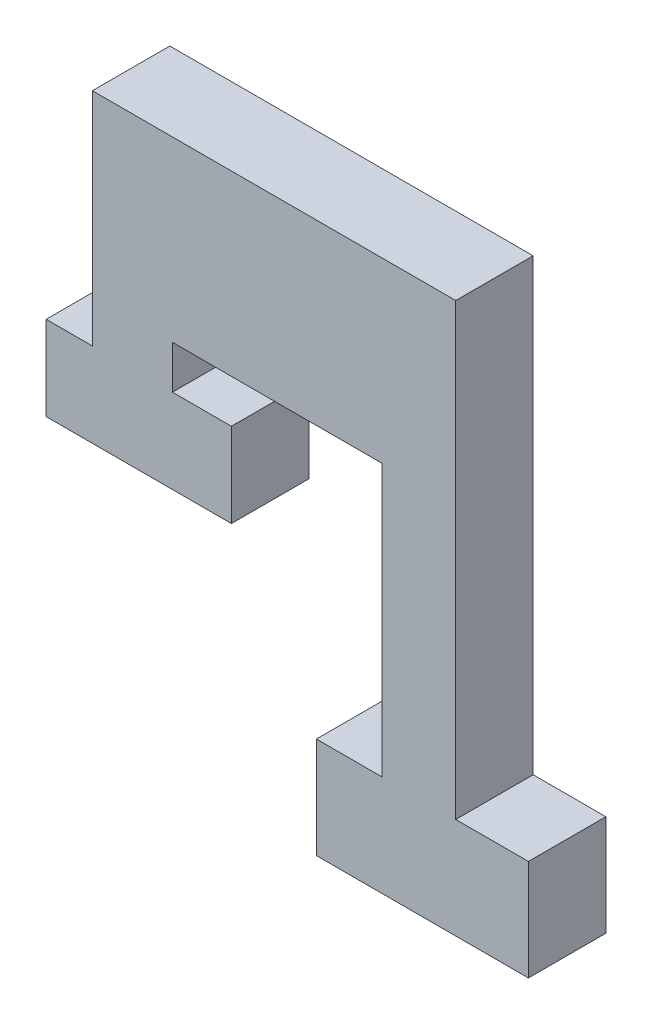
ISO-10303-21;
HEADER;
FILE_DESCRIPTION(('STEP AP214'),'2;1');
FILE_NAME('part.step','',(''),(''),'','','');
FILE_SCHEMA(('AUTOMOTIVE_DESIGN { 1 0 10303 214 1 1 1 1 }'));
ENDSEC;
DATA;
#1=APPLICATION_CONTEXT('core data for automotive mechanical design processes');
#2=APPLICATION_PROTOCOL_DEFINITION('international standard','automotive_design',2000,#1);
#3=PRODUCT_CONTEXT('',#1,'mechanical');
#4=PRODUCT('Part','Part','',(#3));
#5=PRODUCT_RELATED_PRODUCT_CATEGORY('part','',(#4));
#6=PRODUCT_DEFINITION_FORMATION('','',#4);
#7=PRODUCT_DEFINITION_CONTEXT('part definition',#1,'design');
#8=PRODUCT_DEFINITION('design','',#6,#7);
#9=PRODUCT_DEFINITION_SHAPE('','',#8);
#10=(LENGTH_UNIT() NAMED_UNIT(*) SI_UNIT(.MILLI.,.METRE.));
#11=(NAMED_UNIT(*) PLANE_ANGLE_UNIT() SI_UNIT($,.RADIAN.));
#12=(NAMED_UNIT(*) SI_UNIT($,.STERADIAN.) SOLID_ANGLE_UNIT());
#13=UNCERTAINTY_MEASURE_WITH_UNIT(LENGTH_MEASURE(1.E-05),#10,'distance_accuracy_value','');
#14=(GEOMETRIC_REPRESENTATION_CONTEXT(3) GLOBAL_UNCERTAINTY_ASSIGNED_CONTEXT((#13)) GLOBAL_UNIT_ASSIGNED_CONTEXT((#10,
#11,#12)) REPRESENTATION_CONTEXT('',''));
#15=CARTESIAN_POINT('',(0.,0.,0.));
#16=DIRECTION('',(0.,0.,1.));
#17=DIRECTION('',(1.,0.,0.));
#18=AXIS2_PLACEMENT_3D('',#15,#16,#17);
#19=CARTESIAN_POINT('',(16.9520275868381,-85.9662613981763,20.));
#20=DIRECTION('',(1.,0.,0.));
#21=DIRECTION('',(0.,0.,-1.));
#22=AXIS2_PLACEMENT_3D('',#19,#20,#21);
#23=PLANE('',#22);
#24=DIRECTION('',(0.,0.,-1.));
#25=VECTOR('',#24,1.);
#26=CARTESIAN_POINT('',(16.9520275868381,-70.1347932398303,20.));
#27=LINE('',#26,#25);
#28=CARTESIAN_POINT('',(16.9520275868381,-70.1347932398303,20.));
#29=VERTEX_POINT('',#28);
#30=CARTESIAN_POINT('',(16.9520275868381,-70.1347932398303,0.));
#31=VERTEX_POINT('',#30);
#32=EDGE_CURVE('E69',#29,#31,#27,.T.);
#33=ORIENTED_EDGE('',*,*,#32,.F.);
#34=DIRECTION('',(0.,-1.,0.));
#35=VECTOR('',#34,1.);
#36=CARTESIAN_POINT('',(16.9520275868381,-85.9662613981763,20.));
#37=LINE('',#36,#35);
#38=CARTESIAN_POINT('',(16.9520275868381,0.,20.));
#39=VERTEX_POINT('',#38);
#40=EDGE_CURVE('E279',#39,#29,#37,.T.);
#41=ORIENTED_EDGE('',*,*,#40,.F.);
#42=DIRECTION('',(0.,0.,-1.));
#43=VECTOR('',#42,1.);
#44=CARTESIAN_POINT('',(16.9520275868381,0.,20.));
#45=LINE('',#44,#43);
#46=CARTESIAN_POINT('',(16.9520275868381,0.,0.));
#47=VERTEX_POINT('',#46);
#48=EDGE_CURVE('E54',#39,#47,#45,.T.);
#49=ORIENTED_EDGE('',*,*,#48,.T.);
#50=DIRECTION('',(0.,-1.,0.));
#51=VECTOR('',#50,1.);
#52=CARTESIAN_POINT('',(16.9520275868381,-85.9662613981763,0.));
#53=LINE('',#52,#51);
#54=EDGE_CURVE('E294',#47,#31,#53,.T.);
#55=ORIENTED_EDGE('',*,*,#54,.T.);
#56=EDGE_LOOP('',(#33,#41,#49,#55));
#57=FACE_BOUND('',#56,.T.);
#58=ADVANCED_FACE('F45',(#57),#23,.F.);
#59=CARTESIAN_POINT('',(35.982726674984,45.936170212766,20.));
#60=DIRECTION('',(-1.,0.,0.));
#61=DIRECTION('',(0.,0.,1.));
#62=AXIS2_PLACEMENT_3D('',#59,#60,#61);
#63=PLANE('',#62);
#64=DIRECTION('',(0.,0.,1.));
#65=VECTOR('',#64,1.);
#66=CARTESIAN_POINT('',(35.982726674984,-70.1347932398303,20.));
#67=LINE('',#66,#65);
#68=CARTESIAN_POINT('',(35.982726674984,-70.1347932398303,0.));
#69=VERTEX_POINT('',#68);
#70=CARTESIAN_POINT('',(35.982726674984,-70.1347932398303,20.));
#71=VERTEX_POINT('',#70);
#72=EDGE_CURVE('E189',#69,#71,#67,.T.);
#73=ORIENTED_EDGE('',*,*,#72,.F.);
#74=DIRECTION('',(0.,1.,0.));
#75=VECTOR('',#74,1.);
#76=CARTESIAN_POINT('',(35.982726674984,45.936170212766,0.));
#77=LINE('',#76,#75);
#78=CARTESIAN_POINT('',(35.982726674984,45.936170212766,0.));
#79=VERTEX_POINT('',#78);
#80=EDGE_CURVE('E297',#69,#79,#77,.T.);
#81=ORIENTED_EDGE('',*,*,#80,.T.);
#82=DIRECTION('',(0.,0.,-1.));
#83=VECTOR('',#82,1.);
#84=CARTESIAN_POINT('',(35.982726674984,45.936170212766,20.));
#85=LINE('',#84,#83);
#86=CARTESIAN_POINT('',(35.982726674984,45.936170212766,20.));
#87=VERTEX_POINT('',#86);
#88=EDGE_CURVE('E308',#87,#79,#85,.T.);
#89=ORIENTED_EDGE('',*,*,#88,.F.);
#90=DIRECTION('',(0.,1.,0.));
#91=VECTOR('',#90,1.);
#92=CARTESIAN_POINT('',(35.982726674984,45.936170212766,20.));
#93=LINE('',#92,#91);
#94=EDGE_CURVE('E61',#71,#87,#93,.T.);
#95=ORIENTED_EDGE('',*,*,#94,.F.);
#96=EDGE_LOOP('',(#73,#81,#89,#95));
#97=FACE_BOUND('',#96,.T.);
#98=ADVANCED_FACE('F369',(#97),#63,.F.);
#99=CARTESIAN_POINT('',(-37.1870301639218,0.,20.));
#100=DIRECTION('',(-1.,0.,0.));
#101=DIRECTION('',(0.,0.,1.));
#102=AXIS2_PLACEMENT_3D('',#99,#100,#101);
#103=PLANE('',#102);
#104=DIRECTION('',(0.,0.,1.));
#105=VECTOR('',#104,1.);
#106=CARTESIAN_POINT('',(-37.1870301639218,-11.1554942409407,20.));
#107=LINE('',#106,#105);
#108=CARTESIAN_POINT('',(-37.1870301639218,-11.1554942409407,0.));
#109=VERTEX_POINT('',#108);
#110=CARTESIAN_POINT('',(-37.1870301639218,-11.1554942409407,20.));
#111=VERTEX_POINT('',#110);
#112=EDGE_CURVE('E263',#109,#111,#107,.T.);
#113=ORIENTED_EDGE('',*,*,#112,.F.);
#114=DIRECTION('',(0.,1.,0.));
#115=VECTOR('',#114,1.);
#116=CARTESIAN_POINT('',(-37.1870301639218,0.,0.));
#117=LINE('',#116,#115);
#118=CARTESIAN_POINT('',(-37.1870301639218,0.,0.));
#119=VERTEX_POINT('',#118);
#120=EDGE_CURVE('E267',#109,#119,#117,.T.);
#121=ORIENTED_EDGE('',*,*,#120,.T.);
#122=DIRECTION('',(0.,0.,-1.));
#123=VECTOR('',#122,1.);
#124=CARTESIAN_POINT('',(-37.1870301639218,0.,20.));
#125=LINE('',#124,#123);
#126=CARTESIAN_POINT('',(-37.1870301639218,0.,20.));
#127=VERTEX_POINT('',#126);
#128=EDGE_CURVE('E11',#127,#119,#125,.T.);
#129=ORIENTED_EDGE('',*,*,#128,.F.);
#130=DIRECTION('',(0.,1.,0.));
#131=VECTOR('',#130,1.);
#132=CARTESIAN_POINT('',(-37.1870301639218,0.,20.));
#133=LINE('',#132,#131);
#134=EDGE_CURVE('E272',#111,#127,#133,.T.);
#135=ORIENTED_EDGE('',*,*,#134,.F.);
#136=EDGE_LOOP('',(#113,#121,#129,#135));
#137=FACE_BOUND('',#136,.T.);
#138=ADVANCED_FACE('F47',(#137),#103,.F.);
#139=CARTESIAN_POINT('',(-57.8583067596665,0.,20.));
#140=DIRECTION('',(1.,0.,0.));
#141=DIRECTION('',(0.,0.,-1.));
#142=AXIS2_PLACEMENT_3D('',#139,#140,#141);
#143=PLANE('',#142);
#144=DIRECTION('',(0.,0.,-1.));
#145=VECTOR('',#144,1.);
#146=CARTESIAN_POINT('',(-57.8583067596665,-11.1554942409407,20.));
#147=LINE('',#146,#145);
#148=CARTESIAN_POINT('',(-57.8583067596665,-11.1554942409407,20.));
#149=VERTEX_POINT('',#148);
#150=CARTESIAN_POINT('',(-57.8583067596665,-11.1554942409407,0.));
#151=VERTEX_POINT('',#150);
#152=EDGE_CURVE('E259',#149,#151,#147,.T.);
#153=ORIENTED_EDGE('',*,*,#152,.F.);
#154=DIRECTION('',(0.,-1.,0.));
#155=VECTOR('',#154,1.);
#156=CARTESIAN_POINT('',(-57.8583067596665,-22.6399696048632,20.));
#157=LINE('',#156,#155);
#158=CARTESIAN_POINT('',(-57.8583067596665,45.936170212766,20.));
#159=VERTEX_POINT('',#158);
#160=EDGE_CURVE('E268',#159,#149,#157,.T.);
#161=ORIENTED_EDGE('',*,*,#160,.F.);
#162=DIRECTION('',(0.,0.,-1.));
#163=VECTOR('',#162,1.);
#164=CARTESIAN_POINT('',(-57.8583067596665,45.936170212766,20.));
#165=LINE('',#164,#163);
#166=CARTESIAN_POINT('',(-57.8583067596665,45.936170212766,0.));
#167=VERTEX_POINT('',#166);
#168=EDGE_CURVE('E288',#159,#167,#165,.T.);
#169=ORIENTED_EDGE('',*,*,#168,.T.);
#170=DIRECTION('',(0.,-1.,0.));
#171=VECTOR('',#170,1.);
#172=CARTESIAN_POINT('',(-57.8583067596665,0.,0.));
#173=LINE('',#172,#171);
#174=EDGE_CURVE('E273',#167,#151,#173,.T.);
#175=ORIENTED_EDGE('',*,*,#174,.T.);
#176=EDGE_LOOP('',(#153,#161,#169,#175));
#177=FACE_BOUND('',#176,.T.);
#178=ADVANCED_FACE('F389',(#177),#143,.F.);
#179=CARTESIAN_POINT('',(16.9520275868381,0.,20.));
#180=DIRECTION('',(0.,1.,0.));
#181=DIRECTION('',(0.,0.,1.));
#182=AXIS2_PLACEMENT_3D('',#179,#180,#181);
#183=PLANE('',#182);
#184=DIRECTION('',(1.,0.,0.));
#185=VECTOR('',#184,1.);
#186=CARTESIAN_POINT('',(16.9520275868381,0.,0.));
#187=LINE('',#186,#185);
#188=EDGE_CURVE('E291',#119,#47,#187,.T.);
#189=ORIENTED_EDGE('',*,*,#188,.T.);
#190=ORIENTED_EDGE('',*,*,#48,.F.);
#191=DIRECTION('',(1.,0.,0.));
#192=VECTOR('',#191,1.);
#193=CARTESIAN_POINT('',(16.9520275868381,0.,20.));
#194=LINE('',#193,#192);
#195=EDGE_CURVE('E276',#127,#39,#194,.T.);
#196=ORIENTED_EDGE('',*,*,#195,.F.);
#197=ORIENTED_EDGE('',*,*,#128,.T.);
#198=EDGE_LOOP('',(#189,#190,#196,#197));
#199=FACE_BOUND('',#198,.T.);
#200=ADVANCED_FACE('F319',(#199),#183,.F.);
#201=CARTESIAN_POINT('',(-57.8583067596665,45.936170212766,20.));
#202=DIRECTION('',(0.,-1.,0.));
#203=DIRECTION('',(0.,0.,-1.));
#204=AXIS2_PLACEMENT_3D('',#201,#202,#203);
#205=PLANE('',#204);
#206=DIRECTION('',(-1.,0.,0.));
#207=VECTOR('',#206,1.);
#208=CARTESIAN_POINT('',(-57.8583067596665,45.936170212766,0.));
#209=LINE('',#208,#207);
#210=EDGE_CURVE('E300',#79,#167,#209,.T.);
#211=ORIENTED_EDGE('',*,*,#210,.T.);
#212=ORIENTED_EDGE('',*,*,#168,.F.);
#213=DIRECTION('',(-1.,0.,0.));
#214=VECTOR('',#213,1.);
#215=CARTESIAN_POINT('',(-57.8583067596665,45.936170212766,20.));
#216=LINE('',#215,#214);
#217=EDGE_CURVE('E284',#87,#159,#216,.T.);
#218=ORIENTED_EDGE('',*,*,#217,.F.);
#219=ORIENTED_EDGE('',*,*,#88,.T.);
#220=EDGE_LOOP('',(#211,#212,#218,#219));
#221=FACE_BOUND('',#220,.T.);
#222=ADVANCED_FACE('F388',(#221),#205,.F.);
#223=CARTESIAN_POINT('',(0.,0.,20.));
#224=DIRECTION('',(0.,0.,-1.));
#225=DIRECTION('',(-1.,0.,0.));
#226=AXIS2_PLACEMENT_3D('',#223,#224,#225);
#227=PLANE('',#226);
#228=ORIENTED_EDGE('',*,*,#40,.T.);
#229=DIRECTION('',(-1.,0.,0.));
#230=VECTOR('',#229,1.);
#231=CARTESIAN_POINT('',(0.,-70.1347932398303,20.));
#232=LINE('',#231,#230);
#233=CARTESIAN_POINT('',(0.,-70.1347932398303,20.));
#234=VERTEX_POINT('',#233);
#235=EDGE_CURVE('E181',#29,#234,#232,.T.);
#236=ORIENTED_EDGE('',*,*,#235,.T.);
#237=DIRECTION('',(0.,-1.,0.));
#238=VECTOR('',#237,1.);
#239=CARTESIAN_POINT('',(0.,-70.1347932398303,20.));
#240=LINE('',#239,#238);
#241=CARTESIAN_POINT('',(0.,-96.2071872178802,20.));
#242=VERTEX_POINT('',#241);
#243=EDGE_CURVE('E172',#234,#242,#240,.T.);
#244=ORIENTED_EDGE('',*,*,#243,.T.);
#245=DIRECTION('',(1.,0.,0.));
#246=VECTOR('',#245,1.);
#247=CARTESIAN_POINT('',(0.,-96.2071872178802,20.));
#248=LINE('',#247,#246);
#249=CARTESIAN_POINT('',(54.7494549800272,-96.2071872178802,20.));
#250=VERTEX_POINT('',#249);
#251=EDGE_CURVE('E207',#242,#250,#248,.T.);
#252=ORIENTED_EDGE('',*,*,#251,.T.);
#253=DIRECTION('',(0.,1.,0.));
#254=VECTOR('',#253,1.);
#255=CARTESIAN_POINT('',(54.7494549800272,-70.1347932398303,20.));
#256=LINE('',#255,#254);
#257=CARTESIAN_POINT('',(54.7494549800272,-70.1347932398303,20.));
#258=VERTEX_POINT('',#257);
#259=EDGE_CURVE('E204',#250,#258,#256,.T.);
#260=ORIENTED_EDGE('',*,*,#259,.T.);
#261=EDGE_CURVE('E200',#258,#71,#232,.T.);
#262=ORIENTED_EDGE('',*,*,#261,.T.);
#263=ORIENTED_EDGE('',*,*,#94,.T.);
#264=ORIENTED_EDGE('',*,*,#217,.T.);
#265=ORIENTED_EDGE('',*,*,#160,.T.);
#266=DIRECTION('',(-1.,0.,0.));
#267=VECTOR('',#266,1.);
#268=CARTESIAN_POINT('',(-69.7905240219199,-11.1554942409407,20.));
#269=LINE('',#268,#267);
#270=CARTESIAN_POINT('',(-69.7905240219199,-11.1554942409407,20.));
#271=VERTEX_POINT('',#270);
#272=EDGE_CURVE('E226',#149,#271,#269,.T.);
#273=ORIENTED_EDGE('',*,*,#272,.T.);
#274=DIRECTION('',(0.,-1.,0.));
#275=VECTOR('',#274,1.);
#276=CARTESIAN_POINT('',(-69.7905240219199,-11.1554942409407,20.));
#277=LINE('',#276,#275);
#278=CARTESIAN_POINT('',(-69.7905240219199,-32.9246775624193,20.));
#279=VERTEX_POINT('',#278);
#280=EDGE_CURVE('E215',#271,#279,#277,.T.);
#281=ORIENTED_EDGE('',*,*,#280,.T.);
#282=DIRECTION('',(1.,0.,0.));
#283=VECTOR('',#282,1.);
#284=CARTESIAN_POINT('',(-69.7905240219199,-32.9246775624193,20.));
#285=LINE('',#284,#283);
#286=CARTESIAN_POINT('',(-21.9489467223914,-32.9246775624193,20.));
#287=VERTEX_POINT('',#286);
#288=EDGE_CURVE('E219',#279,#287,#285,.T.);
#289=ORIENTED_EDGE('',*,*,#288,.T.);
#290=DIRECTION('',(0.,1.,0.));
#291=VECTOR('',#290,1.);
#292=CARTESIAN_POINT('',(-21.9489467223914,-11.1554942409407,20.));
#293=LINE('',#292,#291);
#294=CARTESIAN_POINT('',(-21.9489467223914,-11.1554942409407,20.));
#295=VERTEX_POINT('',#294);
#296=EDGE_CURVE('E223',#287,#295,#293,.T.);
#297=ORIENTED_EDGE('',*,*,#296,.T.);
#298=EDGE_CURVE('E227',#295,#111,#269,.T.);
#299=ORIENTED_EDGE('',*,*,#298,.T.);
#300=ORIENTED_EDGE('',*,*,#134,.T.);
#301=ORIENTED_EDGE('',*,*,#195,.T.);
#302=EDGE_LOOP('',(#228,#236,#244,#252,#260,#262,#263,#264,#265,#273,#281,#289,#297,#299,#300,#301));
#303=FACE_BOUND('',#302,.T.);
#304=ADVANCED_FACE('F326',(#303),#227,.F.);
#305=CARTESIAN_POINT('',(0.,0.,0.));
#306=DIRECTION('',(0.,0.,-1.));
#307=DIRECTION('',(-1.,0.,0.));
#308=AXIS2_PLACEMENT_3D('',#305,#306,#307);
#309=PLANE('',#308);
#310=DIRECTION('',(-1.,0.,0.));
#311=VECTOR('',#310,1.);
#312=CARTESIAN_POINT('',(0.,-70.1347932398303,0.));
#313=LINE('',#312,#311);
#314=CARTESIAN_POINT('',(0.,-70.1347932398303,0.));
#315=VERTEX_POINT('',#314);
#316=EDGE_CURVE('E161',#31,#315,#313,.T.);
#317=ORIENTED_EDGE('',*,*,#316,.F.);
#318=ORIENTED_EDGE('',*,*,#54,.F.);
#319=ORIENTED_EDGE('',*,*,#188,.F.);
#320=ORIENTED_EDGE('',*,*,#120,.F.);
#321=DIRECTION('',(-1.,0.,0.));
#322=VECTOR('',#321,1.);
#323=CARTESIAN_POINT('',(-69.7905240219199,-11.1554942409407,0.));
#324=LINE('',#323,#322);
#325=CARTESIAN_POINT('',(-21.9489467223914,-11.1554942409407,0.));
#326=VERTEX_POINT('',#325);
#327=EDGE_CURVE('E220',#326,#109,#324,.T.);
#328=ORIENTED_EDGE('',*,*,#327,.F.);
#329=DIRECTION('',(0.,1.,0.));
#330=VECTOR('',#329,1.);
#331=CARTESIAN_POINT('',(-21.9489467223914,-11.1554942409407,0.));
#332=LINE('',#331,#330);
#333=CARTESIAN_POINT('',(-21.9489467223914,-32.9246775624193,0.));
#334=VERTEX_POINT('',#333);
#335=EDGE_CURVE('E238',#334,#326,#332,.T.);
#336=ORIENTED_EDGE('',*,*,#335,.F.);
#337=DIRECTION('',(1.,0.,0.));
#338=VECTOR('',#337,1.);
#339=CARTESIAN_POINT('',(-69.7905240219199,-32.9246775624193,0.));
#340=LINE('',#339,#338);
#341=CARTESIAN_POINT('',(-69.7905240219199,-32.9246775624193,0.));
#342=VERTEX_POINT('',#341);
#343=EDGE_CURVE('E235',#342,#334,#340,.T.);
#344=ORIENTED_EDGE('',*,*,#343,.F.);
#345=DIRECTION('',(0.,-1.,0.));
#346=VECTOR('',#345,1.);
#347=CARTESIAN_POINT('',(-69.7905240219199,-11.1554942409407,0.));
#348=LINE('',#347,#346);
#349=CARTESIAN_POINT('',(-69.7905240219199,-11.1554942409407,0.));
#350=VERTEX_POINT('',#349);
#351=EDGE_CURVE('E214',#350,#342,#348,.T.);
#352=ORIENTED_EDGE('',*,*,#351,.F.);
#353=EDGE_CURVE('E241',#151,#350,#324,.T.);
#354=ORIENTED_EDGE('',*,*,#353,.F.);
#355=ORIENTED_EDGE('',*,*,#174,.F.);
#356=ORIENTED_EDGE('',*,*,#210,.F.);
#357=ORIENTED_EDGE('',*,*,#80,.F.);
#358=CARTESIAN_POINT('',(54.7494549800272,-70.1347932398303,0.));
#359=VERTEX_POINT('',#358);
#360=EDGE_CURVE('E171',#359,#69,#313,.T.);
#361=ORIENTED_EDGE('',*,*,#360,.F.);
#362=DIRECTION('',(0.,1.,0.));
#363=VECTOR('',#362,1.);
#364=CARTESIAN_POINT('',(54.7494549800272,-70.1347932398303,0.));
#365=LINE('',#364,#363);
#366=CARTESIAN_POINT('',(54.7494549800272,-96.2071872178802,0.));
#367=VERTEX_POINT('',#366);
#368=EDGE_CURVE('E196',#367,#359,#365,.T.);
#369=ORIENTED_EDGE('',*,*,#368,.F.);
#370=DIRECTION('',(1.,0.,0.));
#371=VECTOR('',#370,1.);
#372=CARTESIAN_POINT('',(0.,-96.2071872178802,0.));
#373=LINE('',#372,#371);
#374=CARTESIAN_POINT('',(0.,-96.2071872178802,0.));
#375=VERTEX_POINT('',#374);
#376=EDGE_CURVE('E186',#375,#367,#373,.T.);
#377=ORIENTED_EDGE('',*,*,#376,.F.);
#378=DIRECTION('',(0.,-1.,0.));
#379=VECTOR('',#378,1.);
#380=CARTESIAN_POINT('',(0.,-70.1347932398303,0.));
#381=LINE('',#380,#379);
#382=EDGE_CURVE('E178',#315,#375,#381,.T.);
#383=ORIENTED_EDGE('',*,*,#382,.F.);
#384=EDGE_LOOP('',(#317,#318,#319,#320,#328,#336,#344,#352,#354,#355,#356,#357,#361,#369,#377,#383));
#385=FACE_BOUND('',#384,.T.);
#386=ADVANCED_FACE('F184',(#385),#309,.T.);
#387=CARTESIAN_POINT('',(-69.7905240219199,-11.1554942409407,20.));
#388=DIRECTION('',(0.,-1.,0.));
#389=DIRECTION('',(0.,0.,-1.));
#390=AXIS2_PLACEMENT_3D('',#387,#388,#389);
#391=PLANE('',#390);
#392=ORIENTED_EDGE('',*,*,#327,.T.);
#393=ORIENTED_EDGE('',*,*,#112,.T.);
#394=ORIENTED_EDGE('',*,*,#298,.F.);
#395=DIRECTION('',(0.,0.,-1.));
#396=VECTOR('',#395,1.);
#397=CARTESIAN_POINT('',(-21.9489467223914,-11.1554942409407,20.));
#398=LINE('',#397,#396);
#399=EDGE_CURVE('E248',#295,#326,#398,.T.);
#400=ORIENTED_EDGE('',*,*,#399,.T.);
#401=EDGE_LOOP('',(#392,#393,#394,#400));
#402=FACE_BOUND('',#401,.T.);
#403=ADVANCED_FACE('F324',(#402),#391,.F.);
#404=ORIENTED_EDGE('',*,*,#272,.F.);
#405=ORIENTED_EDGE('',*,*,#152,.T.);
#406=ORIENTED_EDGE('',*,*,#353,.T.);
#407=DIRECTION('',(0.,0.,-1.));
#408=VECTOR('',#407,1.);
#409=CARTESIAN_POINT('',(-69.7905240219199,-11.1554942409407,20.));
#410=LINE('',#409,#408);
#411=EDGE_CURVE('E231',#271,#350,#410,.T.);
#412=ORIENTED_EDGE('',*,*,#411,.F.);
#413=EDGE_LOOP('',(#404,#405,#406,#412));
#414=FACE_BOUND('',#413,.T.);
#415=ADVANCED_FACE('F344',(#414),#391,.F.);
#416=CARTESIAN_POINT('',(-69.7905240219199,-11.1554942409407,20.));
#417=DIRECTION('',(1.,0.,0.));
#418=DIRECTION('',(0.,0.,-1.));
#419=AXIS2_PLACEMENT_3D('',#416,#417,#418);
#420=PLANE('',#419);
#421=ORIENTED_EDGE('',*,*,#351,.T.);
#422=DIRECTION('',(0.,0.,-1.));
#423=VECTOR('',#422,1.);
#424=CARTESIAN_POINT('',(-69.7905240219199,-32.9246775624193,20.));
#425=LINE('',#424,#423);
#426=EDGE_CURVE('E256',#279,#342,#425,.T.);
#427=ORIENTED_EDGE('',*,*,#426,.F.);
#428=ORIENTED_EDGE('',*,*,#280,.F.);
#429=ORIENTED_EDGE('',*,*,#411,.T.);
#430=EDGE_LOOP('',(#421,#427,#428,#429));
#431=FACE_BOUND('',#430,.T.);
#432=ADVANCED_FACE('F340',(#431),#420,.F.);
#433=CARTESIAN_POINT('',(-69.7905240219199,-32.9246775624193,20.));
#434=DIRECTION('',(0.,1.,0.));
#435=DIRECTION('',(0.,0.,1.));
#436=AXIS2_PLACEMENT_3D('',#433,#434,#435);
#437=PLANE('',#436);
#438=ORIENTED_EDGE('',*,*,#343,.T.);
#439=DIRECTION('',(0.,0.,-1.));
#440=VECTOR('',#439,1.);
#441=CARTESIAN_POINT('',(-21.9489467223914,-32.9246775624193,20.));
#442=LINE('',#441,#440);
#443=EDGE_CURVE('E252',#287,#334,#442,.T.);
#444=ORIENTED_EDGE('',*,*,#443,.F.);
#445=ORIENTED_EDGE('',*,*,#288,.F.);
#446=ORIENTED_EDGE('',*,*,#426,.T.);
#447=EDGE_LOOP('',(#438,#444,#445,#446));
#448=FACE_BOUND('',#447,.T.);
#449=ADVANCED_FACE('F337',(#448),#437,.F.);
#450=CARTESIAN_POINT('',(-21.9489467223914,-11.1554942409407,20.));
#451=DIRECTION('',(-1.,0.,0.));
#452=DIRECTION('',(0.,0.,1.));
#453=AXIS2_PLACEMENT_3D('',#450,#451,#452);
#454=PLANE('',#453);
#455=ORIENTED_EDGE('',*,*,#335,.T.);
#456=ORIENTED_EDGE('',*,*,#399,.F.);
#457=ORIENTED_EDGE('',*,*,#296,.F.);
#458=ORIENTED_EDGE('',*,*,#443,.T.);
#459=EDGE_LOOP('',(#455,#456,#457,#458));
#460=FACE_BOUND('',#459,.T.);
#461=ADVANCED_FACE('F331',(#460),#454,.F.);
#462=CARTESIAN_POINT('',(0.,-70.1347932398303,20.));
#463=DIRECTION('',(0.,-1.,0.));
#464=DIRECTION('',(0.,0.,-1.));
#465=AXIS2_PLACEMENT_3D('',#462,#463,#464);
#466=PLANE('',#465);
#467=ORIENTED_EDGE('',*,*,#235,.F.);
#468=ORIENTED_EDGE('',*,*,#32,.T.);
#469=ORIENTED_EDGE('',*,*,#316,.T.);
#470=DIRECTION('',(0.,0.,-1.));
#471=VECTOR('',#470,1.);
#472=CARTESIAN_POINT('',(0.,-70.1347932398303,20.));
#473=LINE('',#472,#471);
#474=EDGE_CURVE('E165',#234,#315,#473,.T.);
#475=ORIENTED_EDGE('',*,*,#474,.F.);
#476=EDGE_LOOP('',(#467,#468,#469,#475));
#477=FACE_BOUND('',#476,.T.);
#478=ADVANCED_FACE('F164',(#477),#466,.F.);
#479=ORIENTED_EDGE('',*,*,#360,.T.);
#480=ORIENTED_EDGE('',*,*,#72,.T.);
#481=ORIENTED_EDGE('',*,*,#261,.F.);
#482=DIRECTION('',(0.,0.,-1.));
#483=VECTOR('',#482,1.);
#484=CARTESIAN_POINT('',(54.7494549800272,-70.1347932398303,20.));
#485=LINE('',#484,#483);
#486=EDGE_CURVE('E182',#258,#359,#485,.T.);
#487=ORIENTED_EDGE('',*,*,#486,.T.);
#488=EDGE_LOOP('',(#479,#480,#481,#487));
#489=FACE_BOUND('',#488,.T.);
#490=ADVANCED_FACE('F367',(#489),#466,.F.);
#491=CARTESIAN_POINT('',(0.,-70.1347932398303,20.));
#492=DIRECTION('',(1.,0.,0.));
#493=DIRECTION('',(0.,0.,-1.));
#494=AXIS2_PLACEMENT_3D('',#491,#492,#493);
#495=PLANE('',#494);
#496=ORIENTED_EDGE('',*,*,#382,.T.);
#497=DIRECTION('',(0.,0.,-1.));
#498=VECTOR('',#497,1.);
#499=CARTESIAN_POINT('',(0.,-96.2071872178802,20.));
#500=LINE('',#499,#498);
#501=EDGE_CURVE('E348',#242,#375,#500,.T.);
#502=ORIENTED_EDGE('',*,*,#501,.F.);
#503=ORIENTED_EDGE('',*,*,#243,.F.);
#504=ORIENTED_EDGE('',*,*,#474,.T.);
#505=EDGE_LOOP('',(#496,#502,#503,#504));
#506=FACE_BOUND('',#505,.T.);
#507=ADVANCED_FACE('F176',(#506),#495,.F.);
#508=CARTESIAN_POINT('',(0.,-96.2071872178802,20.));
#509=DIRECTION('',(0.,1.,0.));
#510=DIRECTION('',(0.,0.,1.));
#511=AXIS2_PLACEMENT_3D('',#508,#509,#510);
#512=PLANE('',#511);
#513=ORIENTED_EDGE('',*,*,#376,.T.);
#514=DIRECTION('',(0.,0.,-1.));
#515=VECTOR('',#514,1.);
#516=CARTESIAN_POINT('',(54.7494549800272,-96.2071872178802,20.));
#517=LINE('',#516,#515);
#518=EDGE_CURVE('E350',#250,#367,#517,.T.);
#519=ORIENTED_EDGE('',*,*,#518,.F.);
#520=ORIENTED_EDGE('',*,*,#251,.F.);
#521=ORIENTED_EDGE('',*,*,#501,.T.);
#522=EDGE_LOOP('',(#513,#519,#520,#521));
#523=FACE_BOUND('',#522,.T.);
#524=ADVANCED_FACE('F372',(#523),#512,.F.);
#525=CARTESIAN_POINT('',(54.7494549800272,-70.1347932398303,20.));
#526=DIRECTION('',(-1.,0.,0.));
#527=DIRECTION('',(0.,0.,1.));
#528=AXIS2_PLACEMENT_3D('',#525,#526,#527);
#529=PLANE('',#528);
#530=ORIENTED_EDGE('',*,*,#368,.T.);
#531=ORIENTED_EDGE('',*,*,#486,.F.);
#532=ORIENTED_EDGE('',*,*,#259,.F.);
#533=ORIENTED_EDGE('',*,*,#518,.T.);
#534=EDGE_LOOP('',(#530,#531,#532,#533));
#535=FACE_BOUND('',#534,.T.);
#536=ADVANCED_FACE('F370',(#535),#529,.F.);
#537=CLOSED_SHELL('',(#58,#98,#138,#178,#200,#222,#304,#386,#403,#415,#432,#449,#461,#478,#490,
#507,#524,#536));
#538=MANIFOLD_SOLID_BREP('B2',#537);
#539=ADVANCED_BREP_SHAPE_REPRESENTATION('',(#18,#538),#14);
#540=SHAPE_DEFINITION_REPRESENTATION(#9,#539);
ENDSEC;
END-ISO-10303-21;
